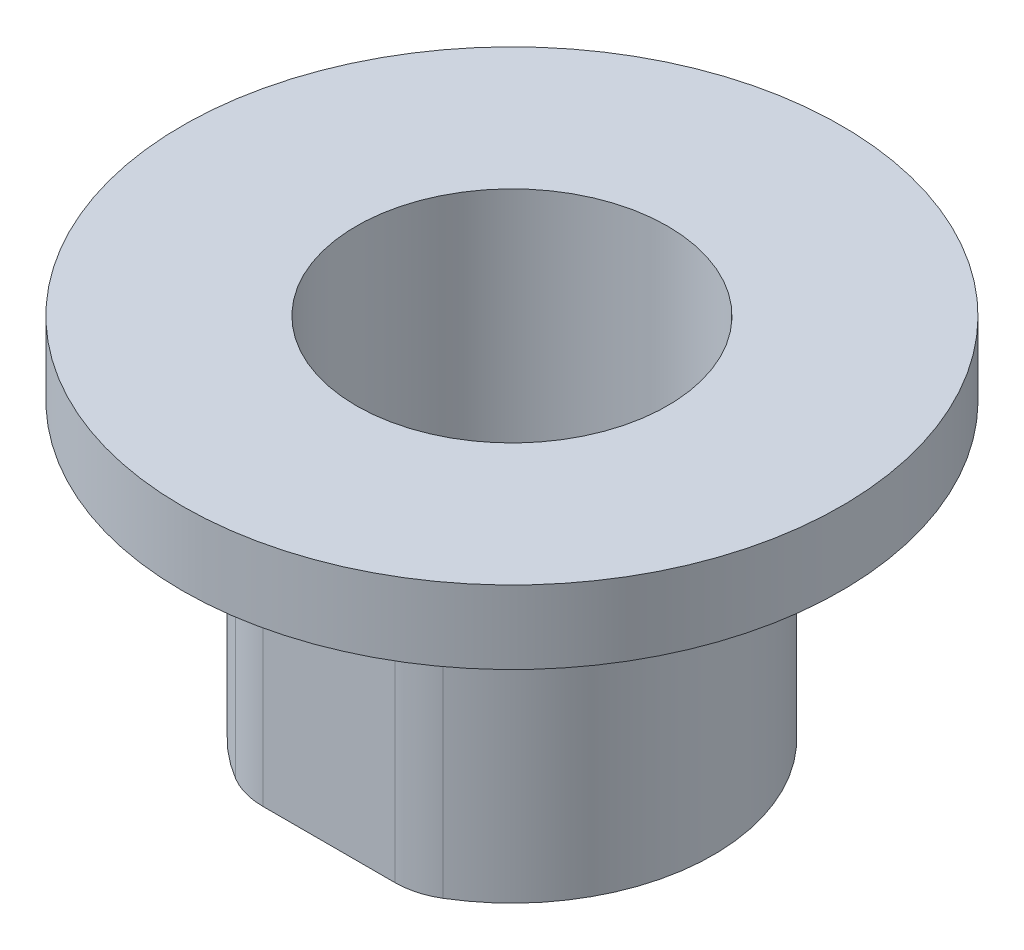
ISO-10303-21;
HEADER;
FILE_DESCRIPTION(('STEP AP214'),'2;1');
FILE_NAME('part.step','',(''),(''),'','','');
FILE_SCHEMA(('AUTOMOTIVE_DESIGN { 1 0 10303 214 1 1 1 1 }'));
ENDSEC;
DATA;
#1=APPLICATION_CONTEXT('core data for automotive mechanical design processes');
#2=APPLICATION_PROTOCOL_DEFINITION('international standard','automotive_design',2000,#1);
#3=PRODUCT_CONTEXT('',#1,'mechanical');
#4=PRODUCT('Part','Part','',(#3));
#5=PRODUCT_RELATED_PRODUCT_CATEGORY('part','',(#4));
#6=PRODUCT_DEFINITION_FORMATION('','',#4);
#7=PRODUCT_DEFINITION_CONTEXT('part definition',#1,'design');
#8=PRODUCT_DEFINITION('design','',#6,#7);
#9=PRODUCT_DEFINITION_SHAPE('','',#8);
#10=(LENGTH_UNIT() NAMED_UNIT(*) SI_UNIT(.MILLI.,.METRE.));
#11=(NAMED_UNIT(*) PLANE_ANGLE_UNIT() SI_UNIT($,.RADIAN.));
#12=(NAMED_UNIT(*) SI_UNIT($,.STERADIAN.) SOLID_ANGLE_UNIT());
#13=UNCERTAINTY_MEASURE_WITH_UNIT(LENGTH_MEASURE(1.E-05),#10,'distance_accuracy_value','');
#14=(GEOMETRIC_REPRESENTATION_CONTEXT(3) GLOBAL_UNCERTAINTY_ASSIGNED_CONTEXT((#13)) GLOBAL_UNIT_ASSIGNED_CONTEXT((#10,
#11,#12)) REPRESENTATION_CONTEXT('',''));
#15=CARTESIAN_POINT('',(0.,0.,0.));
#16=DIRECTION('',(0.,0.,1.));
#17=DIRECTION('',(1.,0.,0.));
#18=AXIS2_PLACEMENT_3D('',#15,#16,#17);
#19=CARTESIAN_POINT('',(1.80277563773199,10.,3.));
#20=DIRECTION('',(0.,-1.,0.));
#21=DIRECTION('',(0.,0.,-1.));
#22=AXIS2_PLACEMENT_3D('',#19,#20,#21);
#23=PLANE('',#22);
#24=CARTESIAN_POINT('',(0.,10.,0.));
#25=DIRECTION('',(0.,1.,0.));
#26=DIRECTION('',(0.,0.,1.));
#27=AXIS2_PLACEMENT_3D('',#24,#25,#26);
#28=CIRCLE('',#27,4.25);
#29=CARTESIAN_POINT('',(0.,10.,4.25));
#30=VERTEX_POINT('',#29);
#31=EDGE_CURVE('E110',#30,#30,#28,.T.);
#32=ORIENTED_EDGE('',*,*,#31,.F.);
#33=EDGE_LOOP('',(#32));
#34=FACE_BOUND('',#33,.T.);
#35=CARTESIAN_POINT('',(0.,10.,0.));
#36=DIRECTION('',(0.,1.,0.));
#37=DIRECTION('',(0.,0.,1.));
#38=AXIS2_PLACEMENT_3D('',#35,#36,#37);
#39=CIRCLE('',#38,9.);
#40=CARTESIAN_POINT('',(0.,10.,9.));
#41=VERTEX_POINT('',#40);
#42=EDGE_CURVE('E116',#41,#41,#39,.T.);
#43=ORIENTED_EDGE('',*,*,#42,.T.);
#44=EDGE_LOOP('',(#43));
#45=FACE_BOUND('',#44,.T.);
#46=ADVANCED_FACE('F33',(#34,#45),#23,.F.);
#47=CARTESIAN_POINT('',(0.,1.,0.));
#48=DIRECTION('',(0.,1.,0.));
#49=DIRECTION('',(0.,0.,1.));
#50=AXIS2_PLACEMENT_3D('',#47,#48,#49);
#51=CYLINDRICAL_SURFACE('',#50,4.25);
#52=CARTESIAN_POINT('',(0.,1.,0.));
#53=DIRECTION('',(0.,1.,0.));
#54=DIRECTION('',(0.,0.,1.));
#55=AXIS2_PLACEMENT_3D('',#52,#53,#54);
#56=CIRCLE('',#55,4.25);
#57=CARTESIAN_POINT('',(0.,1.,4.25));
#58=VERTEX_POINT('',#57);
#59=EDGE_CURVE('E92',#58,#58,#56,.T.);
#60=ORIENTED_EDGE('',*,*,#59,.F.);
#61=EDGE_LOOP('',(#60));
#62=FACE_BOUND('',#61,.T.);
#63=ORIENTED_EDGE('',*,*,#31,.T.);
#64=EDGE_LOOP('',(#63));
#65=FACE_BOUND('',#64,.T.);
#66=ADVANCED_FACE('F136',(#62,#65),#51,.F.);
#67=CARTESIAN_POINT('',(0.,1.,0.));
#68=DIRECTION('',(0.,1.,0.));
#69=DIRECTION('',(0.,0.,1.));
#70=AXIS2_PLACEMENT_3D('',#67,#68,#69);
#71=PLANE('',#70);
#72=ORIENTED_EDGE('',*,*,#59,.T.);
#73=EDGE_LOOP('',(#72));
#74=FACE_BOUND('',#73,.T.);
#75=ADVANCED_FACE('F133',(#74),#71,.T.);
#76=CARTESIAN_POINT('',(0.,8.,0.));
#77=DIRECTION('',(0.,1.,0.));
#78=DIRECTION('',(0.,0.,1.));
#79=AXIS2_PLACEMENT_3D('',#76,#77,#78);
#80=CYLINDRICAL_SURFACE('',#79,9.);
#81=CARTESIAN_POINT('',(0.,8.,0.));
#82=DIRECTION('',(0.,1.,0.));
#83=DIRECTION('',(0.,0.,1.));
#84=AXIS2_PLACEMENT_3D('',#81,#82,#83);
#85=CIRCLE('',#84,9.);
#86=CARTESIAN_POINT('',(0.,8.,9.));
#87=VERTEX_POINT('',#86);
#88=EDGE_CURVE('E113',#87,#87,#85,.T.);
#89=ORIENTED_EDGE('',*,*,#88,.T.);
#90=EDGE_LOOP('',(#89));
#91=FACE_BOUND('',#90,.T.);
#92=ORIENTED_EDGE('',*,*,#42,.F.);
#93=EDGE_LOOP('',(#92));
#94=FACE_BOUND('',#93,.T.);
#95=ADVANCED_FACE('F124',(#91,#94),#80,.T.);
#96=CARTESIAN_POINT('',(0.,8.,0.));
#97=DIRECTION('',(0.,1.,0.));
#98=DIRECTION('',(0.,0.,1.));
#99=AXIS2_PLACEMENT_3D('',#96,#97,#98);
#100=PLANE('',#99);
#101=DIRECTION('',(1.,0.,0.));
#102=VECTOR('',#101,1.);
#103=CARTESIAN_POINT('',(1.80277563773199,8.,5.));
#104=LINE('',#103,#102);
#105=CARTESIAN_POINT('',(-1.80277563773199,8.,5.));
#106=VERTEX_POINT('',#105);
#107=CARTESIAN_POINT('',(1.80277563773199,8.,5.));
#108=VERTEX_POINT('',#107);
#109=EDGE_CURVE('E78',#106,#108,#104,.T.);
#110=ORIENTED_EDGE('',*,*,#109,.T.);
#111=CARTESIAN_POINT('',(1.80277563773199,8.,3.));
#112=DIRECTION('',(0.,1.,0.));
#113=DIRECTION('',(0.,0.,1.));
#114=AXIS2_PLACEMENT_3D('',#111,#112,#113);
#115=CIRCLE('',#114,2.);
#116=CARTESIAN_POINT('',(2.83293314500742,8.,4.71428571428572));
#117=VERTEX_POINT('',#116);
#118=EDGE_CURVE('E74',#108,#117,#115,.T.);
#119=ORIENTED_EDGE('',*,*,#118,.T.);
#120=CARTESIAN_POINT('',(0.,8.,0.));
#121=DIRECTION('',(0.,1.,0.));
#122=DIRECTION('',(0.,0.,1.));
#123=AXIS2_PLACEMENT_3D('',#120,#121,#122);
#124=CIRCLE('',#123,5.5);
#125=CARTESIAN_POINT('',(-2.83293314500742,8.,4.71428571428572));
#126=VERTEX_POINT('',#125);
#127=EDGE_CURVE('E77',#117,#126,#124,.T.);
#128=ORIENTED_EDGE('',*,*,#127,.T.);
#129=CARTESIAN_POINT('',(-1.80277563773199,8.,3.));
#130=DIRECTION('',(0.,1.,0.));
#131=DIRECTION('',(0.,0.,1.));
#132=AXIS2_PLACEMENT_3D('',#129,#130,#131);
#133=CIRCLE('',#132,2.);
#134=EDGE_CURVE('E50',#126,#106,#133,.T.);
#135=ORIENTED_EDGE('',*,*,#134,.T.);
#136=EDGE_LOOP('',(#110,#119,#128,#135));
#137=FACE_BOUND('',#136,.T.);
#138=ORIENTED_EDGE('',*,*,#88,.F.);
#139=EDGE_LOOP('',(#138));
#140=FACE_BOUND('',#139,.T.);
#141=ADVANCED_FACE('F75',(#137,#140),#100,.F.);
#142=CARTESIAN_POINT('',(1.80277563773199,0.,3.));
#143=DIRECTION('',(0.,-1.,0.));
#144=DIRECTION('',(0.,0.,-1.));
#145=AXIS2_PLACEMENT_3D('',#142,#143,#144);
#146=PLANE('',#145);
#147=CARTESIAN_POINT('',(1.80277563773199,0.,3.));
#148=DIRECTION('',(0.,-1.,0.));
#149=DIRECTION('',(0.,0.,-1.));
#150=AXIS2_PLACEMENT_3D('',#147,#148,#149);
#151=CIRCLE('',#150,2.);
#152=CARTESIAN_POINT('',(2.83293314500742,0.,4.71428571428572));
#153=VERTEX_POINT('',#152);
#154=CARTESIAN_POINT('',(1.80277563773199,0.,5.));
#155=VERTEX_POINT('',#154);
#156=EDGE_CURVE('E86',#153,#155,#151,.T.);
#157=ORIENTED_EDGE('',*,*,#156,.T.);
#158=DIRECTION('',(-1.,0.,0.));
#159=VECTOR('',#158,1.);
#160=CARTESIAN_POINT('',(1.80277563773199,0.,5.));
#161=LINE('',#160,#159);
#162=CARTESIAN_POINT('',(-1.80277563773199,0.,5.));
#163=VERTEX_POINT('',#162);
#164=EDGE_CURVE('E91',#155,#163,#161,.T.);
#165=ORIENTED_EDGE('',*,*,#164,.T.);
#166=CARTESIAN_POINT('',(-1.80277563773199,0.,3.));
#167=DIRECTION('',(0.,-1.,0.));
#168=DIRECTION('',(0.,0.,-1.));
#169=AXIS2_PLACEMENT_3D('',#166,#167,#168);
#170=CIRCLE('',#169,2.);
#171=CARTESIAN_POINT('',(-2.83293314500742,0.,4.71428571428572));
#172=VERTEX_POINT('',#171);
#173=EDGE_CURVE('E98',#163,#172,#170,.T.);
#174=ORIENTED_EDGE('',*,*,#173,.T.);
#175=CARTESIAN_POINT('',(0.,0.,0.));
#176=DIRECTION('',(0.,-1.,0.));
#177=DIRECTION('',(0.,0.,-1.));
#178=AXIS2_PLACEMENT_3D('',#175,#176,#177);
#179=CIRCLE('',#178,5.5);
#180=EDGE_CURVE('E95',#172,#153,#179,.T.);
#181=ORIENTED_EDGE('',*,*,#180,.T.);
#182=EDGE_LOOP('',(#157,#165,#174,#181));
#183=FACE_BOUND('',#182,.T.);
#184=ADVANCED_FACE('F96',(#183),#146,.T.);
#185=CARTESIAN_POINT('',(1.80277563773199,10.,5.));
#186=DIRECTION('',(0.,0.,1.));
#187=DIRECTION('',(1.,0.,0.));
#188=AXIS2_PLACEMENT_3D('',#185,#186,#187);
#189=PLANE('',#188);
#190=DIRECTION('',(0.,-1.,0.));
#191=VECTOR('',#190,1.);
#192=CARTESIAN_POINT('',(1.80277563773199,10.,5.));
#193=LINE('',#192,#191);
#194=EDGE_CURVE('E37',#108,#155,#193,.T.);
#195=ORIENTED_EDGE('',*,*,#194,.F.);
#196=ORIENTED_EDGE('',*,*,#109,.F.);
#197=DIRECTION('',(0.,-1.,0.));
#198=VECTOR('',#197,1.);
#199=CARTESIAN_POINT('',(-1.80277563773199,10.,5.));
#200=LINE('',#199,#198);
#201=EDGE_CURVE('E100',#106,#163,#200,.T.);
#202=ORIENTED_EDGE('',*,*,#201,.T.);
#203=ORIENTED_EDGE('',*,*,#164,.F.);
#204=EDGE_LOOP('',(#195,#196,#202,#203));
#205=FACE_BOUND('',#204,.T.);
#206=ADVANCED_FACE('F106',(#205),#189,.T.);
#207=CARTESIAN_POINT('',(-1.80277563773199,10.,3.));
#208=DIRECTION('',(0.,-1.,0.));
#209=DIRECTION('',(0.,0.,-1.));
#210=AXIS2_PLACEMENT_3D('',#207,#208,#209);
#211=CYLINDRICAL_SURFACE('',#210,2.);
#212=ORIENTED_EDGE('',*,*,#201,.F.);
#213=ORIENTED_EDGE('',*,*,#134,.F.);
#214=DIRECTION('',(0.,-1.,0.));
#215=VECTOR('',#214,1.);
#216=CARTESIAN_POINT('',(-2.83293314500742,10.,4.71428571428572));
#217=LINE('',#216,#215);
#218=EDGE_CURVE('E42',#126,#172,#217,.T.);
#219=ORIENTED_EDGE('',*,*,#218,.T.);
#220=ORIENTED_EDGE('',*,*,#173,.F.);
#221=EDGE_LOOP('',(#212,#213,#219,#220));
#222=FACE_BOUND('',#221,.T.);
#223=ADVANCED_FACE('F108',(#222),#211,.T.);
#224=CARTESIAN_POINT('',(0.,10.,0.));
#225=DIRECTION('',(0.,-1.,0.));
#226=DIRECTION('',(0.,0.,-1.));
#227=AXIS2_PLACEMENT_3D('',#224,#225,#226);
#228=CYLINDRICAL_SURFACE('',#227,5.5);
#229=ORIENTED_EDGE('',*,*,#218,.F.);
#230=ORIENTED_EDGE('',*,*,#127,.F.);
#231=DIRECTION('',(0.,-1.,0.));
#232=VECTOR('',#231,1.);
#233=CARTESIAN_POINT('',(2.83293314500742,10.,4.71428571428572));
#234=LINE('',#233,#232);
#235=EDGE_CURVE('E11',#117,#153,#234,.T.);
#236=ORIENTED_EDGE('',*,*,#235,.T.);
#237=ORIENTED_EDGE('',*,*,#180,.F.);
#238=EDGE_LOOP('',(#229,#230,#236,#237));
#239=FACE_BOUND('',#238,.T.);
#240=ADVANCED_FACE('F83',(#239),#228,.T.);
#241=CARTESIAN_POINT('',(1.80277563773199,10.,3.));
#242=DIRECTION('',(0.,-1.,0.));
#243=DIRECTION('',(0.,0.,-1.));
#244=AXIS2_PLACEMENT_3D('',#241,#242,#243);
#245=CYLINDRICAL_SURFACE('',#244,2.);
#246=ORIENTED_EDGE('',*,*,#235,.F.);
#247=ORIENTED_EDGE('',*,*,#118,.F.);
#248=ORIENTED_EDGE('',*,*,#194,.T.);
#249=ORIENTED_EDGE('',*,*,#156,.F.);
#250=EDGE_LOOP('',(#246,#247,#248,#249));
#251=FACE_BOUND('',#250,.T.);
#252=ADVANCED_FACE('F35',(#251),#245,.T.);
#253=CLOSED_SHELL('',(#46,#66,#75,#95,#141,#184,#206,#223,#240,#252));
#254=MANIFOLD_SOLID_BREP('B2',#253);
#255=ADVANCED_BREP_SHAPE_REPRESENTATION('',(#18,#254),#14);
#256=SHAPE_DEFINITION_REPRESENTATION(#9,#255);
ENDSEC;
END-ISO-10303-21;
